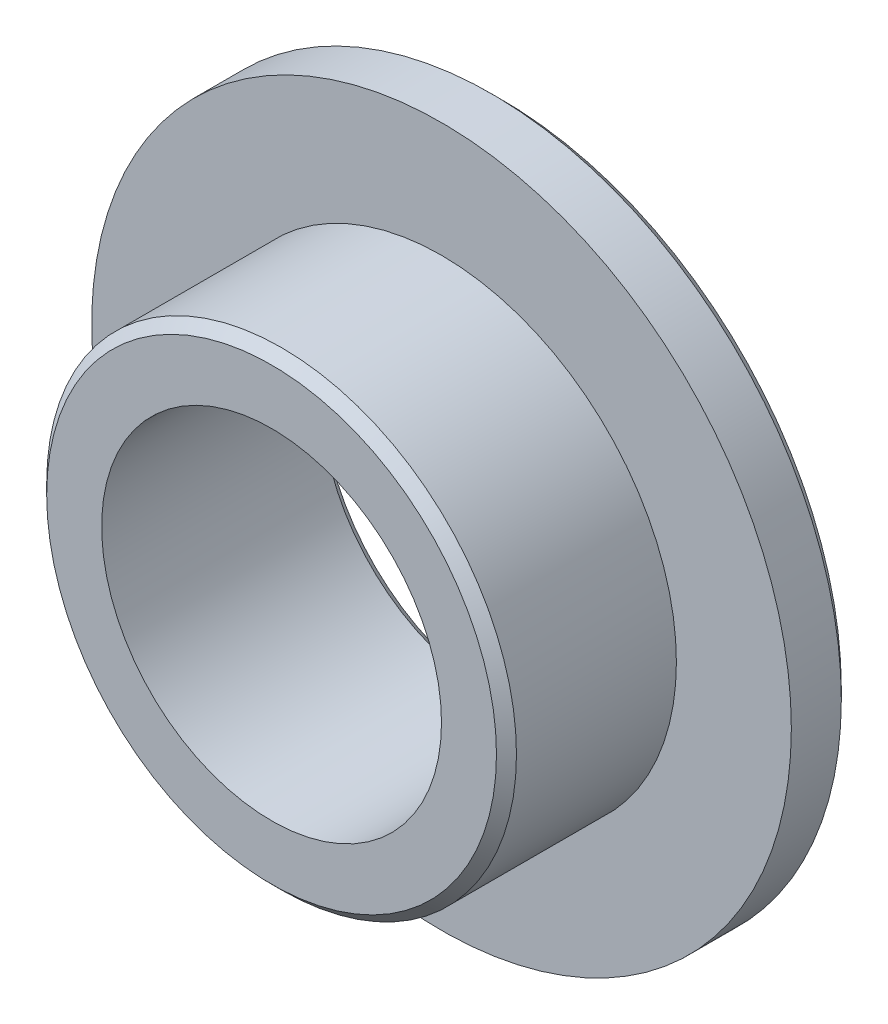
ISO-10303-21;
HEADER;
FILE_DESCRIPTION(('STEP AP214'),'2;1');
FILE_NAME('part.step','',(''),(''),'','','');
FILE_SCHEMA(('AUTOMOTIVE_DESIGN { 1 0 10303 214 1 1 1 1 }'));
ENDSEC;
DATA;
#1=APPLICATION_CONTEXT('core data for automotive mechanical design processes');
#2=APPLICATION_PROTOCOL_DEFINITION('international standard','automotive_design',2000,#1);
#3=PRODUCT_CONTEXT('',#1,'mechanical');
#4=PRODUCT('Part','Part','',(#3));
#5=PRODUCT_RELATED_PRODUCT_CATEGORY('part','',(#4));
#6=PRODUCT_DEFINITION_FORMATION('','',#4);
#7=PRODUCT_DEFINITION_CONTEXT('part definition',#1,'design');
#8=PRODUCT_DEFINITION('design','',#6,#7);
#9=PRODUCT_DEFINITION_SHAPE('','',#8);
#10=(LENGTH_UNIT() NAMED_UNIT(*) SI_UNIT(.MILLI.,.METRE.));
#11=(NAMED_UNIT(*) PLANE_ANGLE_UNIT() SI_UNIT($,.RADIAN.));
#12=(NAMED_UNIT(*) SI_UNIT($,.STERADIAN.) SOLID_ANGLE_UNIT());
#13=UNCERTAINTY_MEASURE_WITH_UNIT(LENGTH_MEASURE(1.E-05),#10,'distance_accuracy_value','');
#14=(GEOMETRIC_REPRESENTATION_CONTEXT(3) GLOBAL_UNCERTAINTY_ASSIGNED_CONTEXT((#13)) GLOBAL_UNIT_ASSIGNED_CONTEXT((#10,
#11,#12)) REPRESENTATION_CONTEXT('',''));
#15=CARTESIAN_POINT('',(0.,0.,0.));
#16=DIRECTION('',(0.,0.,1.));
#17=DIRECTION('',(1.,0.,0.));
#18=AXIS2_PLACEMENT_3D('',#15,#16,#17);
#19=CARTESIAN_POINT('',(0.,0.,3.));
#20=DIRECTION('',(0.,0.,1.));
#21=DIRECTION('',(1.,0.,0.));
#22=AXIS2_PLACEMENT_3D('',#19,#20,#21);
#23=PLANE('',#22);
#24=CARTESIAN_POINT('',(0.,0.,3.));
#25=DIRECTION('',(0.,0.,1.));
#26=DIRECTION('',(1.,0.,0.));
#27=AXIS2_PLACEMENT_3D('',#24,#25,#26);
#28=CIRCLE('',#27,17.5);
#29=CARTESIAN_POINT('',(17.5,0.,3.));
#30=VERTEX_POINT('',#29);
#31=EDGE_CURVE('E59',#30,#30,#28,.T.);
#32=ORIENTED_EDGE('',*,*,#31,.T.);
#33=EDGE_LOOP('',(#32));
#34=FACE_BOUND('',#33,.T.);
#35=CARTESIAN_POINT('',(0.,0.,3.));
#36=DIRECTION('',(0.,0.,1.));
#37=DIRECTION('',(1.,0.,0.));
#38=AXIS2_PLACEMENT_3D('',#35,#36,#37);
#39=CIRCLE('',#38,11.75);
#40=CARTESIAN_POINT('',(11.75,0.,3.));
#41=VERTEX_POINT('',#40);
#42=EDGE_CURVE('E62',#41,#41,#39,.T.);
#43=ORIENTED_EDGE('',*,*,#42,.F.);
#44=EDGE_LOOP('',(#43));
#45=FACE_BOUND('',#44,.T.);
#46=ADVANCED_FACE('F33',(#34,#45),#23,.T.);
#47=CARTESIAN_POINT('',(0.,0.,3.));
#48=DIRECTION('',(0.,0.,-1.));
#49=DIRECTION('',(-1.,0.,0.));
#50=AXIS2_PLACEMENT_3D('',#47,#48,#49);
#51=CYLINDRICAL_SURFACE('',#50,17.5);
#52=CARTESIAN_POINT('',(0.,0.,0.5));
#53=DIRECTION('',(0.,0.,1.));
#54=DIRECTION('',(1.,0.,0.));
#55=AXIS2_PLACEMENT_3D('',#52,#53,#54);
#56=CIRCLE('',#55,17.5);
#57=CARTESIAN_POINT('',(17.5,0.,0.5));
#58=VERTEX_POINT('',#57);
#59=EDGE_CURVE('E10',#58,#58,#56,.T.);
#60=ORIENTED_EDGE('',*,*,#59,.T.);
#61=EDGE_LOOP('',(#60));
#62=FACE_BOUND('',#61,.T.);
#63=ORIENTED_EDGE('',*,*,#31,.F.);
#64=EDGE_LOOP('',(#63));
#65=FACE_BOUND('',#64,.T.);
#66=ADVANCED_FACE('F86',(#62,#65),#51,.T.);
#67=CARTESIAN_POINT('',(0.,0.,0.));
#68=DIRECTION('',(0.,0.,1.));
#69=DIRECTION('',(1.,0.,0.));
#70=AXIS2_PLACEMENT_3D('',#67,#68,#69);
#71=PLANE('',#70);
#72=CARTESIAN_POINT('',(0.,0.,0.));
#73=DIRECTION('',(0.,0.,1.));
#74=DIRECTION('',(1.,0.,0.));
#75=AXIS2_PLACEMENT_3D('',#72,#73,#74);
#76=CIRCLE('',#75,9.);
#77=CARTESIAN_POINT('',(9.,0.,0.));
#78=VERTEX_POINT('',#77);
#79=EDGE_CURVE('E53',#78,#78,#76,.T.);
#80=ORIENTED_EDGE('',*,*,#79,.T.);
#81=EDGE_LOOP('',(#80));
#82=FACE_BOUND('',#81,.T.);
#83=CARTESIAN_POINT('',(0.,0.,0.));
#84=DIRECTION('',(0.,0.,1.));
#85=DIRECTION('',(1.,0.,0.));
#86=AXIS2_PLACEMENT_3D('',#83,#84,#85);
#87=CIRCLE('',#86,17.);
#88=CARTESIAN_POINT('',(17.,0.,0.));
#89=VERTEX_POINT('',#88);
#90=EDGE_CURVE('E56',#89,#89,#87,.F.);
#91=ORIENTED_EDGE('',*,*,#90,.T.);
#92=EDGE_LOOP('',(#91));
#93=FACE_BOUND('',#92,.T.);
#94=ADVANCED_FACE('F83',(#82,#93),#71,.F.);
#95=CARTESIAN_POINT('',(0.,0.,11.5));
#96=DIRECTION('',(0.,0.,-1.));
#97=DIRECTION('',(-1.,0.,0.));
#98=AXIS2_PLACEMENT_3D('',#95,#96,#97);
#99=CYLINDRICAL_SURFACE('',#98,11.75);
#100=CARTESIAN_POINT('',(0.,0.,11.));
#101=DIRECTION('',(0.,0.,1.));
#102=DIRECTION('',(1.,0.,0.));
#103=AXIS2_PLACEMENT_3D('',#100,#101,#102);
#104=CIRCLE('',#103,11.75);
#105=CARTESIAN_POINT('',(11.75,0.,11.));
#106=VERTEX_POINT('',#105);
#107=EDGE_CURVE('E40',#106,#106,#104,.F.);
#108=ORIENTED_EDGE('',*,*,#107,.T.);
#109=EDGE_LOOP('',(#108));
#110=FACE_BOUND('',#109,.T.);
#111=ORIENTED_EDGE('',*,*,#42,.T.);
#112=EDGE_LOOP('',(#111));
#113=FACE_BOUND('',#112,.T.);
#114=ADVANCED_FACE('F73',(#110,#113),#99,.T.);
#115=CARTESIAN_POINT('',(0.,0.,11.5));
#116=DIRECTION('',(0.,0.,1.));
#117=DIRECTION('',(1.,0.,0.));
#118=AXIS2_PLACEMENT_3D('',#115,#116,#117);
#119=PLANE('',#118);
#120=CARTESIAN_POINT('',(0.,0.,11.5));
#121=DIRECTION('',(0.,0.,1.));
#122=DIRECTION('',(1.,0.,0.));
#123=AXIS2_PLACEMENT_3D('',#120,#121,#122);
#124=CIRCLE('',#123,11.25);
#125=CARTESIAN_POINT('',(11.25,0.,11.5));
#126=VERTEX_POINT('',#125);
#127=EDGE_CURVE('E44',#126,#126,#124,.T.);
#128=ORIENTED_EDGE('',*,*,#127,.T.);
#129=EDGE_LOOP('',(#128));
#130=FACE_BOUND('',#129,.T.);
#131=CARTESIAN_POINT('',(0.,0.,11.5));
#132=DIRECTION('',(0.,0.,1.));
#133=DIRECTION('',(1.,0.,0.));
#134=AXIS2_PLACEMENT_3D('',#131,#132,#133);
#135=CIRCLE('',#134,8.5);
#136=CARTESIAN_POINT('',(8.5,0.,11.5));
#137=VERTEX_POINT('',#136);
#138=EDGE_CURVE('E65',#137,#137,#135,.T.);
#139=ORIENTED_EDGE('',*,*,#138,.F.);
#140=EDGE_LOOP('',(#139));
#141=FACE_BOUND('',#140,.T.);
#142=ADVANCED_FACE('F71',(#130,#141),#119,.T.);
#143=CARTESIAN_POINT('',(0.,0.,0.));
#144=DIRECTION('',(0.,0.,1.));
#145=DIRECTION('',(1.,0.,0.));
#146=AXIS2_PLACEMENT_3D('',#143,#144,#145);
#147=CYLINDRICAL_SURFACE('',#146,8.5);
#148=CARTESIAN_POINT('',(0.,0.,0.499999999999997));
#149=DIRECTION('',(0.,0.,1.));
#150=DIRECTION('',(1.,0.,0.));
#151=AXIS2_PLACEMENT_3D('',#148,#149,#150);
#152=CIRCLE('',#151,8.5);
#153=CARTESIAN_POINT('',(8.5,0.,0.499999999999997));
#154=VERTEX_POINT('',#153);
#155=EDGE_CURVE('E48',#154,#154,#152,.F.);
#156=ORIENTED_EDGE('',*,*,#155,.T.);
#157=EDGE_LOOP('',(#156));
#158=FACE_BOUND('',#157,.T.);
#159=ORIENTED_EDGE('',*,*,#138,.T.);
#160=EDGE_LOOP('',(#159));
#161=FACE_BOUND('',#160,.T.);
#162=ADVANCED_FACE('F69',(#158,#161),#147,.F.);
#163=CARTESIAN_POINT('',(0.,0.,0.));
#164=DIRECTION('',(0.,0.,-1.));
#165=DIRECTION('',(-1.,0.,0.));
#166=AXIS2_PLACEMENT_3D('',#163,#164,#165);
#167=CONICAL_SURFACE('',#166,9.,0.785398163397452);
#168=ORIENTED_EDGE('',*,*,#155,.F.);
#169=EDGE_LOOP('',(#168));
#170=FACE_BOUND('',#169,.T.);
#171=ORIENTED_EDGE('',*,*,#79,.F.);
#172=EDGE_LOOP('',(#171));
#173=FACE_BOUND('',#172,.T.);
#174=ADVANCED_FACE('F80',(#170,#173),#167,.F.);
#175=CARTESIAN_POINT('',(0.,0.,11.5));
#176=DIRECTION('',(0.,0.,-1.));
#177=DIRECTION('',(-1.,0.,0.));
#178=AXIS2_PLACEMENT_3D('',#175,#176,#177);
#179=CONICAL_SURFACE('',#178,11.25,0.785398163397452);
#180=ORIENTED_EDGE('',*,*,#107,.F.);
#181=EDGE_LOOP('',(#180));
#182=FACE_BOUND('',#181,.T.);
#183=ORIENTED_EDGE('',*,*,#127,.F.);
#184=EDGE_LOOP('',(#183));
#185=FACE_BOUND('',#184,.T.);
#186=ADVANCED_FACE('F99',(#182,#185),#179,.T.);
#187=CARTESIAN_POINT('',(0.,0.,0.5));
#188=DIRECTION('',(0.,0.,1.));
#189=DIRECTION('',(1.,0.,0.));
#190=AXIS2_PLACEMENT_3D('',#187,#188,#189);
#191=CONICAL_SURFACE('',#190,17.5,0.785398163397448);
#192=ORIENTED_EDGE('',*,*,#90,.F.);
#193=EDGE_LOOP('',(#192));
#194=FACE_BOUND('',#193,.T.);
#195=ORIENTED_EDGE('',*,*,#59,.F.);
#196=EDGE_LOOP('',(#195));
#197=FACE_BOUND('',#196,.T.);
#198=ADVANCED_FACE('F35',(#194,#197),#191,.T.);
#199=CLOSED_SHELL('',(#46,#66,#94,#114,#142,#162,#174,#186,#198));
#200=MANIFOLD_SOLID_BREP('B2',#199);
#201=ADVANCED_BREP_SHAPE_REPRESENTATION('',(#18,#200),#14);
#202=SHAPE_DEFINITION_REPRESENTATION(#9,#201);
ENDSEC;
END-ISO-10303-21;
